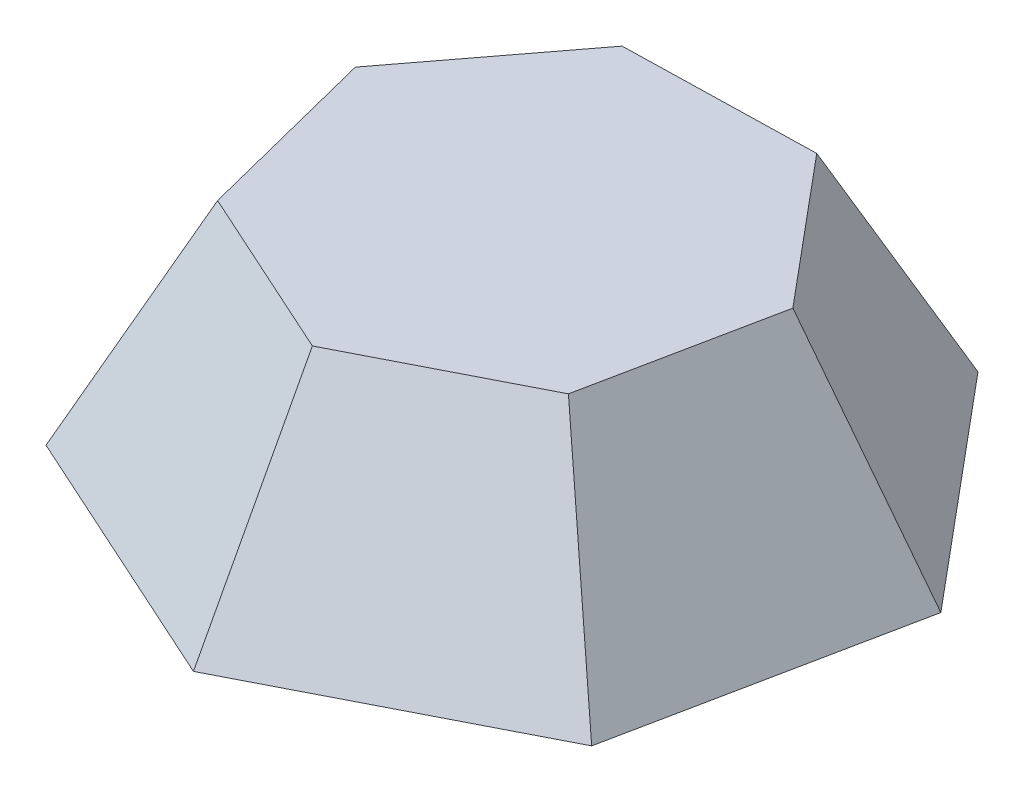
ISO-10303-21;
HEADER;
FILE_DESCRIPTION(('STEP AP214'),'2;1');
FILE_NAME('part.step','',(''),(''),'','','');
FILE_SCHEMA(('AUTOMOTIVE_DESIGN { 1 0 10303 214 1 1 1 1 }'));
ENDSEC;
DATA;
#1=APPLICATION_CONTEXT('core data for automotive mechanical design processes');
#2=APPLICATION_PROTOCOL_DEFINITION('international standard','automotive_design',2000,#1);
#3=PRODUCT_CONTEXT('',#1,'mechanical');
#4=PRODUCT('Part','Part','',(#3));
#5=PRODUCT_RELATED_PRODUCT_CATEGORY('part','',(#4));
#6=PRODUCT_DEFINITION_FORMATION('','',#4);
#7=PRODUCT_DEFINITION_CONTEXT('part definition',#1,'design');
#8=PRODUCT_DEFINITION('design','',#6,#7);
#9=PRODUCT_DEFINITION_SHAPE('','',#8);
#10=(LENGTH_UNIT() NAMED_UNIT(*) SI_UNIT(.MILLI.,.METRE.));
#11=(NAMED_UNIT(*) PLANE_ANGLE_UNIT() SI_UNIT($,.RADIAN.));
#12=(NAMED_UNIT(*) SI_UNIT($,.STERADIAN.) SOLID_ANGLE_UNIT());
#13=UNCERTAINTY_MEASURE_WITH_UNIT(LENGTH_MEASURE(1.E-05),#10,'distance_accuracy_value','');
#14=(GEOMETRIC_REPRESENTATION_CONTEXT(3) GLOBAL_UNCERTAINTY_ASSIGNED_CONTEXT((#13)) GLOBAL_UNIT_ASSIGNED_CONTEXT((#10,
#11,#12)) REPRESENTATION_CONTEXT('',''));
#15=CARTESIAN_POINT('',(0.,0.,0.));
#16=DIRECTION('',(0.,0.,1.));
#17=DIRECTION('',(1.,0.,0.));
#18=AXIS2_PLACEMENT_3D('',#15,#16,#17);
#19=CARTESIAN_POINT('',(0.,0.,0.));
#20=DIRECTION('',(0.,1.,0.));
#21=DIRECTION('',(0.,0.,1.));
#22=AXIS2_PLACEMENT_3D('',#19,#20,#21);
#23=PLANE('',#22);
#24=DIRECTION('',(0.890603016266573,0.,-0.454781560110876));
#25=VECTOR('',#24,1.);
#26=CARTESIAN_POINT('',(0.233007768391195,0.,9.98652845445898));
#27=LINE('',#26,#25);
#28=CARTESIAN_POINT('',(0.233007768391195,0.,9.98652845445898));
#29=VERTEX_POINT('',#28);
#30=CARTESIAN_POINT('',(7.9530603136046,0.,6.04432583833938));
#31=VERTEX_POINT('',#30);
#32=EDGE_CURVE('E104',#29,#31,#27,.T.);
#33=ORIENTED_EDGE('',*,*,#32,.T.);
#34=DIRECTION('',(0.199719356806226,0.,-0.979853141300729));
#35=VECTOR('',#34,1.);
#36=CARTESIAN_POINT('',(7.9530603136046,0.,6.04432583833938));
#37=LINE('',#36,#35);
#38=CARTESIAN_POINT('',(9.68429622980858,0.,-2.44937741582728));
#39=VERTEX_POINT('',#38);
#40=EDGE_CURVE('E124',#31,#39,#37,.T.);
#41=ORIENTED_EDGE('',*,*,#40,.T.);
#42=DIRECTION('',(-0.641557051861637,0.,-0.767075321729623));
#43=VECTOR('',#42,1.);
#44=CARTESIAN_POINT('',(9.68429622980858,0.,-2.44937741582729));
#45=LINE('',#44,#43);
#46=CARTESIAN_POINT('',(4.12305956132466,0.,-9.09864951768221));
#47=VERTEX_POINT('',#46);
#48=EDGE_CURVE('E185',#39,#47,#45,.T.);
#49=ORIENTED_EDGE('',*,*,#48,.T.);
#50=DIRECTION('',(-0.999727915098797,0.,0.023325860588876));
#51=VECTOR('',#50,1.);
#52=CARTESIAN_POINT('',(4.12305956132466,0.,-9.09864951768221));
#53=LINE('',#52,#51);
#54=CARTESIAN_POINT('',(-4.54292505192443,0.,-8.89645295409619));
#55=VERTEX_POINT('',#54);
#56=EDGE_CURVE('E370',#47,#55,#53,.T.);
#57=ORIENTED_EDGE('',*,*,#56,.T.);
#58=DIRECTION('',(-0.60508326753355,0.,0.796162194123108));
#59=VECTOR('',#58,1.);
#60=CARTESIAN_POINT('',(-4.54292505192443,0.,-8.89645295409619));
#61=LINE('',#60,#59);
#62=CARTESIAN_POINT('',(-9.78799444229155,0.,-1.99504586150775));
#63=VERTEX_POINT('',#62);
#64=EDGE_CURVE('E372',#55,#63,#61,.T.);
#65=ORIENTED_EDGE('',*,*,#64,.T.);
#66=DIRECTION('',(0.24520142193374,0.,0.969472156733587));
#67=VECTOR('',#66,1.);
#68=CARTESIAN_POINT('',(-9.78799444229155,0.,-1.99504586150775));
#69=LINE('',#68,#67);
#70=CARTESIAN_POINT('',(-7.66250437891306,0.,6.40867145631509));
#71=VERTEX_POINT('',#70);
#72=EDGE_CURVE('E106',#63,#71,#69,.T.);
#73=ORIENTED_EDGE('',*,*,#72,.T.);
#74=DIRECTION('',(0.910844439487446,0.,0.412749811695658));
#75=VECTOR('',#74,1.);
#76=CARTESIAN_POINT('',(-7.66250437891306,0.,6.40867145631509));
#77=LINE('',#76,#75);
#78=EDGE_CURVE('E100',#71,#29,#77,.T.);
#79=ORIENTED_EDGE('',*,*,#78,.T.);
#80=EDGE_LOOP('',(#33,#41,#49,#57,#65,#73,#79));
#81=FACE_BOUND('',#80,.T.);
#82=ADVANCED_FACE('F49',(#81),#23,.T.);
#83=CARTESIAN_POINT('',(0.,-10.,0.));
#84=DIRECTION('',(0.,1.,0.));
#85=DIRECTION('',(0.,0.,1.));
#86=AXIS2_PLACEMENT_3D('',#83,#84,#85);
#87=PLANE('',#86);
#88=CARTESIAN_POINT('',(0.,-10.,0.));
#89=DIRECTION('',(0.,-1.,0.));
#90=DIRECTION('',(0.,0.,-1.));
#91=AXIS2_PLACEMENT_3D('',#88,#89,#90);
#92=CIRCLE('',#91,1.5);
#93=CARTESIAN_POINT('',(0.,-10.,-1.5));
#94=VERTEX_POINT('',#93);
#95=EDGE_CURVE('E512',#94,#94,#92,.T.);
#96=ORIENTED_EDGE('',*,*,#95,.F.);
#97=EDGE_LOOP('',(#96));
#98=FACE_BOUND('',#97,.T.);
#99=DIRECTION('',(-0.641557051861637,0.,-0.767075321729623));
#100=VECTOR('',#99,1.);
#101=CARTESIAN_POINT('',(15.0644608019244,-10.,-3.81014264684245));
#102=LINE('',#101,#100);
#103=CARTESIAN_POINT('',(15.0644608019244,-10.,-3.81014264684245));
#104=VERTEX_POINT('',#103);
#105=CARTESIAN_POINT('',(6.41364820650502,-10.,-14.1534548052834));
#106=VERTEX_POINT('',#105);
#107=EDGE_CURVE('E282',#104,#106,#102,.T.);
#108=ORIENTED_EDGE('',*,*,#107,.F.);
#109=DIRECTION('',(0.199719356806226,0.,-0.979853141300729));
#110=VECTOR('',#109,1.);
#111=CARTESIAN_POINT('',(12.371427154496,-10.,9.4022846374168));
#112=LINE('',#111,#110);
#113=CARTESIAN_POINT('',(12.371427154496,-10.,9.4022846374168));
#114=VERTEX_POINT('',#113);
#115=EDGE_CURVE('E12',#114,#104,#112,.T.);
#116=ORIENTED_EDGE('',*,*,#115,.F.);
#117=DIRECTION('',(0.890603016266573,0.,-0.454781560110876));
#118=VECTOR('',#117,1.);
#119=CARTESIAN_POINT('',(0.362456528608525,-10.,15.5345998180473));
#120=LINE('',#119,#118);
#121=CARTESIAN_POINT('',(0.362456528608525,-10.,15.5345998180473));
#122=VERTEX_POINT('',#121);
#123=EDGE_CURVE('E60',#122,#114,#120,.T.);
#124=ORIENTED_EDGE('',*,*,#123,.F.);
#125=DIRECTION('',(0.910844439487446,0.,0.412749811695658));
#126=VECTOR('',#125,1.);
#127=CARTESIAN_POINT('',(-11.919451256087,-10.,9.96904448760124));
#128=LINE('',#127,#126);
#129=CARTESIAN_POINT('',(-11.919451256087,-10.,9.96904448760124));
#130=VERTEX_POINT('',#129);
#131=EDGE_CURVE('E132',#130,#122,#128,.T.);
#132=ORIENTED_EDGE('',*,*,#131,.F.);
#133=DIRECTION('',(0.24520142193374,0.,0.969472156733587));
#134=VECTOR('',#133,1.);
#135=CARTESIAN_POINT('',(-15.2257691324535,-10.,-3.10340467345649));
#136=LINE('',#135,#134);
#137=CARTESIAN_POINT('',(-15.2257691324535,-10.,-3.10340467345649));
#138=VERTEX_POINT('',#137);
#139=EDGE_CURVE('E346',#138,#130,#136,.T.);
#140=ORIENTED_EDGE('',*,*,#139,.F.);
#141=DIRECTION('',(-0.60508326753355,0.,0.796162194123108));
#142=VECTOR('',#141,1.);
#143=CARTESIAN_POINT('',(-7.06677230299355,-10.,-13.838926817483));
#144=LINE('',#143,#142);
#145=CARTESIAN_POINT('',(-7.06677230299355,-10.,-13.838926817483));
#146=VERTEX_POINT('',#145);
#147=EDGE_CURVE('E242',#146,#138,#144,.T.);
#148=ORIENTED_EDGE('',*,*,#147,.F.);
#149=DIRECTION('',(-0.999727915098797,0.,0.023325860588876));
#150=VECTOR('',#149,1.);
#151=CARTESIAN_POINT('',(6.41364820650502,-10.,-14.1534548052834));
#152=LINE('',#151,#150);
#153=EDGE_CURVE('E223',#106,#146,#152,.T.);
#154=ORIENTED_EDGE('',*,*,#153,.F.);
#155=EDGE_LOOP('',(#108,#116,#124,#132,#140,#148,#154));
#156=FACE_BOUND('',#155,.T.);
#157=ADVANCED_FACE('F295',(#98,#156),#87,.F.);
#158=CARTESIAN_POINT('',(-6.98019952848184,3.60000000000001,1.76545023792293));
#159=DIRECTION('',(0.867122257899852,-0.447213595499958,-0.21931481904938));
#160=DIRECTION('',(0.458373080165452,0.888759877233236,0.));
#161=AXIS2_PLACEMENT_3D('',#158,#159,#160);
#162=PLANE('',#161);
#163=DIRECTION('',(0.372218473106446,0.874378947743771,-0.311311522467128));
#164=VECTOR('',#163,1.);
#165=CARTESIAN_POINT('',(-11.919451256087,-10.,9.96904448760124));
#166=LINE('',#165,#164);
#167=EDGE_CURVE('E94',#130,#71,#166,.T.);
#168=ORIENTED_EDGE('',*,*,#167,.T.);
#169=ORIENTED_EDGE('',*,*,#72,.F.);
#170=DIRECTION('',(0.475467571165152,0.874378947743771,0.0969125611714279));
#171=VECTOR('',#170,1.);
#172=CARTESIAN_POINT('',(-15.2257691324535,-10.,-3.10340467345649));
#173=LINE('',#172,#171);
#174=EDGE_CURVE('E135',#138,#63,#173,.T.);
#175=ORIENTED_EDGE('',*,*,#174,.F.);
#176=ORIENTED_EDGE('',*,*,#139,.T.);
#177=EDGE_LOOP('',(#168,#169,#175,#176));
#178=FACE_BOUND('',#177,.T.);
#179=ADVANCED_FACE('F257',(#178),#162,.F.);
#180=CARTESIAN_POINT('',(-5.7323677976864,3.60000000000001,-4.35659952624157));
#181=DIRECTION('',(0.712109114869862,-0.447213595499958,0.541202927301084));
#182=DIRECTION('',(0.60508326753355,0.,-0.796162194123108));
#183=AXIS2_PLACEMENT_3D('',#180,#181,#182);
#184=PLANE('',#183);
#185=ORIENTED_EDGE('',*,*,#174,.T.);
#186=ORIENTED_EDGE('',*,*,#64,.F.);
#187=DIRECTION('',(0.220679890365583,0.874378947743771,0.432159509591921));
#188=VECTOR('',#187,1.);
#189=CARTESIAN_POINT('',(-7.06677230299355,-10.,-13.838926817483));
#190=LINE('',#189,#188);
#191=EDGE_CURVE('E111',#146,#55,#190,.T.);
#192=ORIENTED_EDGE('',*,*,#191,.F.);
#193=ORIENTED_EDGE('',*,*,#147,.T.);
#194=EDGE_LOOP('',(#185,#186,#192,#193));
#195=FACE_BOUND('',#194,.T.);
#196=ADVANCED_FACE('F248',(#195),#184,.F.);
#197=CARTESIAN_POINT('',(-2.97179864420874,3.60000000000001,6.55807996430963));
#198=DIRECTION('',(0.369174654660691,-0.447213595499958,-0.814684033448649));
#199=DIRECTION('',(0.,0.876607561018785,-0.481205968338608));
#200=AXIS2_PLACEMENT_3D('',#197,#198,#199);
#201=PLANE('',#200);
#202=DIRECTION('',(-0.0113187270745565,0.874378947743771,-0.485111680090169));
#203=VECTOR('',#202,1.);
#204=CARTESIAN_POINT('',(0.362456528608525,-10.,15.5345998180473));
#205=LINE('',#204,#203);
#206=EDGE_CURVE('E121',#122,#29,#205,.T.);
#207=ORIENTED_EDGE('',*,*,#206,.T.);
#208=ORIENTED_EDGE('',*,*,#78,.F.);
#209=ORIENTED_EDGE('',*,*,#167,.F.);
#210=ORIENTED_EDGE('',*,*,#131,.T.);
#211=EDGE_LOOP('',(#207,#208,#209,#210));
#212=FACE_BOUND('',#211,.T.);
#213=ADVANCED_FACE('F130',(#212),#201,.F.);
#214=CARTESIAN_POINT('',(3.27442723279832,3.60000000000001,6.41234171711934));
#215=DIRECTION('',(-0.406768993328531,-0.447213595499958,-0.796579554135363));
#216=DIRECTION('',(0.,0.871978627231921,-0.489543944555271));
#217=AXIS2_PLACEMENT_3D('',#214,#215,#216);
#218=PLANE('',#217);
#219=DIRECTION('',(-0.386332694908462,0.874378947743771,-0.293612848130426));
#220=VECTOR('',#219,1.);
#221=CARTESIAN_POINT('',(12.371427154496,-10.,9.4022846374168));
#222=LINE('',#221,#220);
#223=EDGE_CURVE('E123',#114,#31,#222,.T.);
#224=ORIENTED_EDGE('',*,*,#223,.T.);
#225=ORIENTED_EDGE('',*,*,#32,.F.);
#226=ORIENTED_EDGE('',*,*,#206,.F.);
#227=ORIENTED_EDGE('',*,*,#123,.T.);
#228=EDGE_LOOP('',(#224,#225,#226,#227));
#229=FACE_BOUND('',#228,.T.);
#230=ADVANCED_FACE('F119',(#229),#218,.F.);
#231=CARTESIAN_POINT('',(7.05494261736527,3.60000000000001,1.43797936900483));
#232=DIRECTION('',(-0.876407292766055,-0.447213595499958,-0.178634423296503));
#233=DIRECTION('',(0.454524385665384,-0.890734294184021,0.));
#234=AXIS2_PLACEMENT_3D('',#231,#232,#233);
#235=PLANE('',#234);
#236=DIRECTION('',(-0.470430263725499,0.874378947743771,0.118982447082135));
#237=VECTOR('',#236,1.);
#238=CARTESIAN_POINT('',(15.0644608019244,-10.,-3.81014264684245));
#239=LINE('',#238,#237);
#240=EDGE_CURVE('E69',#104,#39,#239,.T.);
#241=ORIENTED_EDGE('',*,*,#240,.T.);
#242=ORIENTED_EDGE('',*,*,#40,.F.);
#243=ORIENTED_EDGE('',*,*,#223,.F.);
#244=ORIENTED_EDGE('',*,*,#115,.T.);
#245=EDGE_LOOP('',(#241,#242,#243,#244));
#246=FACE_BOUND('',#245,.T.);
#247=ADVANCED_FACE('F158',(#246),#235,.F.);
#248=CARTESIAN_POINT('',(5.5229423164533,3.60000000000001,-4.6192107734038));
#249=DIRECTION('',(-0.686093025299983,-0.447213595499958,0.573826071762791));
#250=DIRECTION('',(0.641557051861637,0.,0.767075321729623));
#251=AXIS2_PLACEMENT_3D('',#248,#249,#250);
#252=PLANE('',#251);
#253=DIRECTION('',(-0.200284248928664,0.874378947743771,0.44198153284224));
#254=VECTOR('',#253,1.);
#255=CARTESIAN_POINT('',(6.41364820650502,-10.,-14.1534548052834));
#256=LINE('',#255,#254);
#257=EDGE_CURVE('E207',#106,#47,#256,.T.);
#258=ORIENTED_EDGE('',*,*,#257,.T.);
#259=ORIENTED_EDGE('',*,*,#48,.F.);
#260=ORIENTED_EDGE('',*,*,#240,.F.);
#261=ORIENTED_EDGE('',*,*,#107,.T.);
#262=EDGE_LOOP('',(#258,#259,#260,#261));
#263=FACE_BOUND('',#262,.T.);
#264=ADVANCED_FACE('F190',(#263),#252,.F.);
#265=CARTESIAN_POINT('',(-0.167946196239908,3.60000000000001,-7.19804098871136));
#266=DIRECTION('',(0.020863283964164,-0.447213595499958,0.89418383086602));
#267=DIRECTION('',(0.,-0.894378503077303,-0.447310958096492));
#268=AXIS2_PLACEMENT_3D('',#265,#266,#267);
#269=PLANE('',#268);
#270=ORIENTED_EDGE('',*,*,#191,.T.);
#271=ORIENTED_EDGE('',*,*,#56,.F.);
#272=ORIENTED_EDGE('',*,*,#257,.F.);
#273=ORIENTED_EDGE('',*,*,#153,.T.);
#274=EDGE_LOOP('',(#270,#271,#272,#273));
#275=FACE_BOUND('',#274,.T.);
#276=ADVANCED_FACE('F198',(#275),#269,.F.);
#277=CARTESIAN_POINT('',(0.,-3.,0.));
#278=DIRECTION('',(0.,-1.,0.));
#279=DIRECTION('',(0.,0.,-1.));
#280=AXIS2_PLACEMENT_3D('',#277,#278,#279);
#281=CYLINDRICAL_SURFACE('',#280,1.5);
#282=CARTESIAN_POINT('',(0.,-3.,0.));
#283=DIRECTION('',(0.,-1.,0.));
#284=DIRECTION('',(0.,0.,-1.));
#285=AXIS2_PLACEMENT_3D('',#282,#283,#284);
#286=CIRCLE('',#285,1.5);
#287=CARTESIAN_POINT('',(0.,-3.,-1.5));
#288=VERTEX_POINT('',#287);
#289=EDGE_CURVE('E125',#288,#288,#286,.T.);
#290=ORIENTED_EDGE('',*,*,#289,.F.);
#291=EDGE_LOOP('',(#290));
#292=FACE_BOUND('',#291,.T.);
#293=ORIENTED_EDGE('',*,*,#95,.T.);
#294=EDGE_LOOP('',(#293));
#295=FACE_BOUND('',#294,.T.);
#296=ADVANCED_FACE('F305',(#292,#295),#281,.F.);
#297=CARTESIAN_POINT('',(0.,-3.,0.));
#298=DIRECTION('',(0.,-1.,0.));
#299=DIRECTION('',(0.,0.,-1.));
#300=AXIS2_PLACEMENT_3D('',#297,#298,#299);
#301=PLANE('',#300);
#302=ORIENTED_EDGE('',*,*,#289,.T.);
#303=EDGE_LOOP('',(#302));
#304=FACE_BOUND('',#303,.T.);
#305=ADVANCED_FACE('F452',(#304),#301,.T.);
#306=CLOSED_SHELL('',(#82,#157,#179,#196,#213,#230,#247,#264,#276,#296,#305));
#307=MANIFOLD_SOLID_BREP('B2',#306);
#308=ADVANCED_BREP_SHAPE_REPRESENTATION('',(#18,#307),#14);
#309=SHAPE_DEFINITION_REPRESENTATION(#9,#308);
ENDSEC;
END-ISO-10303-21;
